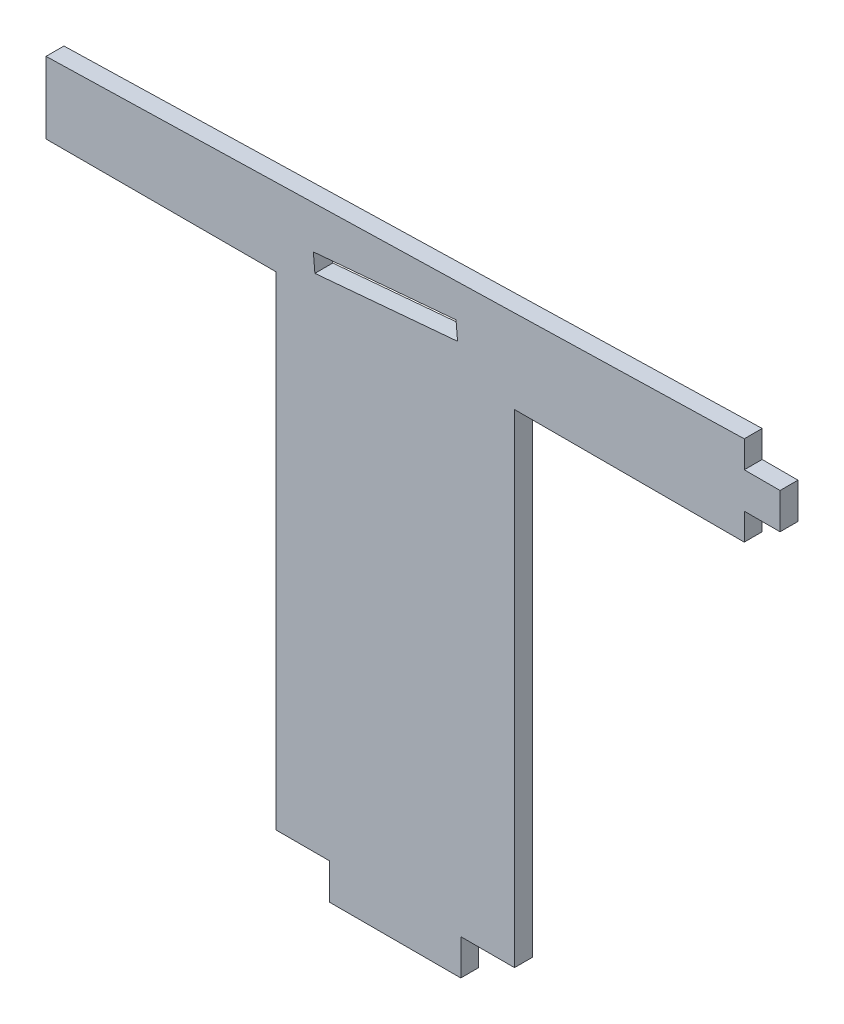
ISO-10303-21;
HEADER;
FILE_DESCRIPTION(('STEP AP214'),'2;1');
FILE_NAME('part.step','',(''),(''),'','','');
FILE_SCHEMA(('AUTOMOTIVE_DESIGN { 1 0 10303 214 1 1 1 1 }'));
ENDSEC;
DATA;
#1=APPLICATION_CONTEXT('core data for automotive mechanical design processes');
#2=APPLICATION_PROTOCOL_DEFINITION('international standard','automotive_design',2000,#1);
#3=PRODUCT_CONTEXT('',#1,'mechanical');
#4=PRODUCT('Part','Part','',(#3));
#5=PRODUCT_RELATED_PRODUCT_CATEGORY('part','',(#4));
#6=PRODUCT_DEFINITION_FORMATION('','',#4);
#7=PRODUCT_DEFINITION_CONTEXT('part definition',#1,'design');
#8=PRODUCT_DEFINITION('design','',#6,#7);
#9=PRODUCT_DEFINITION_SHAPE('','',#8);
#10=(LENGTH_UNIT() NAMED_UNIT(*) SI_UNIT(.MILLI.,.METRE.));
#11=(NAMED_UNIT(*) PLANE_ANGLE_UNIT() SI_UNIT($,.RADIAN.));
#12=(NAMED_UNIT(*) SI_UNIT($,.STERADIAN.) SOLID_ANGLE_UNIT());
#13=UNCERTAINTY_MEASURE_WITH_UNIT(LENGTH_MEASURE(1.E-05),#10,'distance_accuracy_value','');
#14=(GEOMETRIC_REPRESENTATION_CONTEXT(3) GLOBAL_UNCERTAINTY_ASSIGNED_CONTEXT((#13)) GLOBAL_UNIT_ASSIGNED_CONTEXT((#10,
#11,#12)) REPRESENTATION_CONTEXT('',''));
#15=CARTESIAN_POINT('',(0.,0.,0.));
#16=DIRECTION('',(0.,0.,1.));
#17=DIRECTION('',(1.,0.,0.));
#18=AXIS2_PLACEMENT_3D('',#15,#16,#17);
#19=CARTESIAN_POINT('',(-40.,0.,3.));
#20=DIRECTION('',(0.,1.,0.));
#21=DIRECTION('',(0.,0.,1.));
#22=AXIS2_PLACEMENT_3D('',#19,#20,#21);
#23=PLANE('',#22);
#24=DIRECTION('',(0.,0.,1.));
#25=VECTOR('',#24,1.);
#26=CARTESIAN_POINT('',(-9.,0.,0.));
#27=LINE('',#26,#25);
#28=CARTESIAN_POINT('',(-9.,0.,0.));
#29=VERTEX_POINT('',#28);
#30=CARTESIAN_POINT('',(-9.,0.,3.));
#31=VERTEX_POINT('',#30);
#32=EDGE_CURVE('E201',#29,#31,#27,.T.);
#33=ORIENTED_EDGE('',*,*,#32,.F.);
#34=DIRECTION('',(1.,0.,0.));
#35=VECTOR('',#34,1.);
#36=CARTESIAN_POINT('',(-40.,0.,0.));
#37=LINE('',#36,#35);
#38=CARTESIAN_POINT('',(0.,0.,0.));
#39=VERTEX_POINT('',#38);
#40=EDGE_CURVE('E291',#29,#39,#37,.T.);
#41=ORIENTED_EDGE('',*,*,#40,.T.);
#42=DIRECTION('',(0.,0.,-1.));
#43=VECTOR('',#42,1.);
#44=CARTESIAN_POINT('',(0.,0.,3.));
#45=LINE('',#44,#43);
#46=CARTESIAN_POINT('',(0.,0.,3.));
#47=VERTEX_POINT('',#46);
#48=EDGE_CURVE('E309',#47,#39,#45,.T.);
#49=ORIENTED_EDGE('',*,*,#48,.F.);
#50=DIRECTION('',(1.,0.,0.));
#51=VECTOR('',#50,1.);
#52=CARTESIAN_POINT('',(-40.,0.,3.));
#53=LINE('',#52,#51);
#54=EDGE_CURVE('E270',#31,#47,#53,.T.);
#55=ORIENTED_EDGE('',*,*,#54,.F.);
#56=EDGE_LOOP('',(#33,#41,#49,#55));
#57=FACE_BOUND('',#56,.T.);
#58=ADVANCED_FACE('F33',(#57),#23,.F.);
#59=CARTESIAN_POINT('',(38.5,96.,3.));
#60=DIRECTION('',(-1.,0.,0.));
#61=DIRECTION('',(0.,0.,1.));
#62=AXIS2_PLACEMENT_3D('',#59,#60,#61);
#63=PLANE('',#62);
#64=DIRECTION('',(0.,0.,1.));
#65=VECTOR('',#64,1.);
#66=CARTESIAN_POINT('',(38.5,91.5,0.));
#67=LINE('',#66,#65);
#68=CARTESIAN_POINT('',(38.5,91.5,0.));
#69=VERTEX_POINT('',#68);
#70=CARTESIAN_POINT('',(38.5,91.5,3.));
#71=VERTEX_POINT('',#70);
#72=EDGE_CURVE('E220',#69,#71,#67,.T.);
#73=ORIENTED_EDGE('',*,*,#72,.F.);
#74=DIRECTION('',(0.,1.,0.));
#75=VECTOR('',#74,1.);
#76=CARTESIAN_POINT('',(38.5,96.,0.));
#77=LINE('',#76,#75);
#78=CARTESIAN_POINT('',(38.5,96.,0.));
#79=VERTEX_POINT('',#78);
#80=EDGE_CURVE('E298',#69,#79,#77,.T.);
#81=ORIENTED_EDGE('',*,*,#80,.T.);
#82=DIRECTION('',(0.,0.,-1.));
#83=VECTOR('',#82,1.);
#84=CARTESIAN_POINT('',(38.5,96.,3.));
#85=LINE('',#84,#83);
#86=CARTESIAN_POINT('',(38.5,96.,3.));
#87=VERTEX_POINT('',#86);
#88=EDGE_CURVE('E282',#87,#79,#85,.T.);
#89=ORIENTED_EDGE('',*,*,#88,.F.);
#90=DIRECTION('',(0.,1.,0.));
#91=VECTOR('',#90,1.);
#92=CARTESIAN_POINT('',(38.5,96.,3.));
#93=LINE('',#92,#91);
#94=EDGE_CURVE('E278',#71,#87,#93,.T.);
#95=ORIENTED_EDGE('',*,*,#94,.F.);
#96=EDGE_LOOP('',(#73,#81,#89,#95));
#97=FACE_BOUND('',#96,.T.);
#98=ADVANCED_FACE('F345',(#97),#63,.F.);
#99=CARTESIAN_POINT('',(-78.5,93.,3.));
#100=DIRECTION('',(0.0256326007925508,-0.999671430909481,0.));
#101=DIRECTION('',(0.999671430909481,0.0256326007925508,0.));
#102=AXIS2_PLACEMENT_3D('',#99,#100,#101);
#103=PLANE('',#102);
#104=DIRECTION('',(-0.999671430909481,-0.0256326007925508,0.));
#105=VECTOR('',#104,1.);
#106=CARTESIAN_POINT('',(-78.5,93.,0.));
#107=LINE('',#106,#105);
#108=CARTESIAN_POINT('',(-78.5,93.,0.));
#109=VERTEX_POINT('',#108);
#110=EDGE_CURVE('E253',#79,#109,#107,.T.);
#111=ORIENTED_EDGE('',*,*,#110,.T.);
#112=DIRECTION('',(0.,0.,-1.));
#113=VECTOR('',#112,1.);
#114=CARTESIAN_POINT('',(-78.5,93.,3.));
#115=LINE('',#114,#113);
#116=CARTESIAN_POINT('',(-78.5,93.,3.));
#117=VERTEX_POINT('',#116);
#118=EDGE_CURVE('E11',#117,#109,#115,.T.);
#119=ORIENTED_EDGE('',*,*,#118,.F.);
#120=DIRECTION('',(-0.999671430909481,-0.0256326007925508,0.));
#121=VECTOR('',#120,1.);
#122=CARTESIAN_POINT('',(-78.5,93.,3.));
#123=LINE('',#122,#121);
#124=EDGE_CURVE('E260',#87,#117,#123,.T.);
#125=ORIENTED_EDGE('',*,*,#124,.F.);
#126=ORIENTED_EDGE('',*,*,#88,.T.);
#127=EDGE_LOOP('',(#111,#119,#125,#126));
#128=FACE_BOUND('',#127,.T.);
#129=ADVANCED_FACE('F35',(#128),#103,.F.);
#130=CARTESIAN_POINT('',(-78.5,93.,3.));
#131=DIRECTION('',(1.,0.,0.));
#132=DIRECTION('',(0.,0.,-1.));
#133=AXIS2_PLACEMENT_3D('',#130,#131,#132);
#134=PLANE('',#133);
#135=DIRECTION('',(0.,-1.,0.));
#136=VECTOR('',#135,1.);
#137=CARTESIAN_POINT('',(-78.5,93.,0.));
#138=LINE('',#137,#136);
#139=CARTESIAN_POINT('',(-78.5,81.,0.));
#140=VERTEX_POINT('',#139);
#141=EDGE_CURVE('E285',#109,#140,#138,.T.);
#142=ORIENTED_EDGE('',*,*,#141,.T.);
#143=DIRECTION('',(0.,0.,-1.));
#144=VECTOR('',#143,1.);
#145=CARTESIAN_POINT('',(-78.5,81.,3.));
#146=LINE('',#145,#144);
#147=CARTESIAN_POINT('',(-78.5,81.,3.));
#148=VERTEX_POINT('',#147);
#149=EDGE_CURVE('E41',#148,#140,#146,.T.);
#150=ORIENTED_EDGE('',*,*,#149,.F.);
#151=DIRECTION('',(0.,-1.,0.));
#152=VECTOR('',#151,1.);
#153=CARTESIAN_POINT('',(-78.5,93.,3.));
#154=LINE('',#153,#152);
#155=EDGE_CURVE('E263',#117,#148,#154,.T.);
#156=ORIENTED_EDGE('',*,*,#155,.F.);
#157=ORIENTED_EDGE('',*,*,#118,.T.);
#158=EDGE_LOOP('',(#142,#150,#156,#157));
#159=FACE_BOUND('',#158,.T.);
#160=ADVANCED_FACE('F337',(#159),#134,.F.);
#161=CARTESIAN_POINT('',(-78.5,81.,3.));
#162=DIRECTION('',(0.,1.,0.));
#163=DIRECTION('',(0.,0.,1.));
#164=AXIS2_PLACEMENT_3D('',#161,#162,#163);
#165=PLANE('',#164);
#166=DIRECTION('',(1.,0.,0.));
#167=VECTOR('',#166,1.);
#168=CARTESIAN_POINT('',(-78.5,81.,0.));
#169=LINE('',#168,#167);
#170=CARTESIAN_POINT('',(-40.,81.,0.));
#171=VERTEX_POINT('',#170);
#172=EDGE_CURVE('E287',#140,#171,#169,.T.);
#173=ORIENTED_EDGE('',*,*,#172,.T.);
#174=DIRECTION('',(0.,0.,-1.));
#175=VECTOR('',#174,1.);
#176=CARTESIAN_POINT('',(-40.,81.,3.));
#177=LINE('',#176,#175);
#178=CARTESIAN_POINT('',(-40.,81.,3.));
#179=VERTEX_POINT('',#178);
#180=EDGE_CURVE('E315',#179,#171,#177,.T.);
#181=ORIENTED_EDGE('',*,*,#180,.F.);
#182=DIRECTION('',(1.,0.,0.));
#183=VECTOR('',#182,1.);
#184=CARTESIAN_POINT('',(-78.5,81.,3.));
#185=LINE('',#184,#183);
#186=EDGE_CURVE('E266',#148,#179,#185,.T.);
#187=ORIENTED_EDGE('',*,*,#186,.F.);
#188=ORIENTED_EDGE('',*,*,#149,.T.);
#189=EDGE_LOOP('',(#173,#181,#187,#188));
#190=FACE_BOUND('',#189,.T.);
#191=ADVANCED_FACE('F322',(#190),#165,.F.);
#192=CARTESIAN_POINT('',(-40.,81.,3.));
#193=DIRECTION('',(1.,0.,0.));
#194=DIRECTION('',(0.,1.,0.));
#195=AXIS2_PLACEMENT_3D('',#192,#193,#194);
#196=PLANE('',#195);
#197=DIRECTION('',(0.,-1.,0.));
#198=VECTOR('',#197,1.);
#199=CARTESIAN_POINT('',(-40.,81.,0.));
#200=LINE('',#199,#198);
#201=CARTESIAN_POINT('',(-40.,0.,0.));
#202=VERTEX_POINT('',#201);
#203=EDGE_CURVE('E289',#171,#202,#200,.T.);
#204=ORIENTED_EDGE('',*,*,#203,.T.);
#205=DIRECTION('',(0.,0.,-1.));
#206=VECTOR('',#205,1.);
#207=CARTESIAN_POINT('',(-40.,0.,3.));
#208=LINE('',#207,#206);
#209=CARTESIAN_POINT('',(-40.,0.,3.));
#210=VERTEX_POINT('',#209);
#211=EDGE_CURVE('E312',#210,#202,#208,.T.);
#212=ORIENTED_EDGE('',*,*,#211,.F.);
#213=DIRECTION('',(0.,-1.,0.));
#214=VECTOR('',#213,1.);
#215=CARTESIAN_POINT('',(-40.,81.,3.));
#216=LINE('',#215,#214);
#217=EDGE_CURVE('E268',#179,#210,#216,.T.);
#218=ORIENTED_EDGE('',*,*,#217,.F.);
#219=ORIENTED_EDGE('',*,*,#180,.T.);
#220=EDGE_LOOP('',(#204,#212,#218,#219));
#221=FACE_BOUND('',#220,.T.);
#222=ADVANCED_FACE('F328',(#221),#196,.F.);
#223=CARTESIAN_POINT('',(-31.,0.,0.));
#224=VERTEX_POINT('',#223);
#225=EDGE_CURVE('E292',#202,#224,#37,.T.);
#226=ORIENTED_EDGE('',*,*,#225,.T.);
#227=DIRECTION('',(0.,0.,1.));
#228=VECTOR('',#227,1.);
#229=CARTESIAN_POINT('',(-31.,0.,0.));
#230=LINE('',#229,#228);
#231=CARTESIAN_POINT('',(-31.,0.,3.));
#232=VERTEX_POINT('',#231);
#233=EDGE_CURVE('E191',#224,#232,#230,.T.);
#234=ORIENTED_EDGE('',*,*,#233,.T.);
#235=EDGE_CURVE('E271',#210,#232,#53,.T.);
#236=ORIENTED_EDGE('',*,*,#235,.F.);
#237=ORIENTED_EDGE('',*,*,#211,.T.);
#238=EDGE_LOOP('',(#226,#234,#236,#237));
#239=FACE_BOUND('',#238,.T.);
#240=ADVANCED_FACE('F332',(#239),#23,.F.);
#241=CARTESIAN_POINT('',(0.,0.,3.));
#242=DIRECTION('',(-1.,0.,0.));
#243=DIRECTION('',(0.,-1.,0.));
#244=AXIS2_PLACEMENT_3D('',#241,#242,#243);
#245=PLANE('',#244);
#246=DIRECTION('',(0.,1.,0.));
#247=VECTOR('',#246,1.);
#248=CARTESIAN_POINT('',(0.,0.,0.));
#249=LINE('',#248,#247);
#250=CARTESIAN_POINT('',(0.,81.,0.));
#251=VERTEX_POINT('',#250);
#252=EDGE_CURVE('E294',#39,#251,#249,.T.);
#253=ORIENTED_EDGE('',*,*,#252,.T.);
#254=DIRECTION('',(0.,0.,-1.));
#255=VECTOR('',#254,1.);
#256=CARTESIAN_POINT('',(0.,81.,3.));
#257=LINE('',#256,#255);
#258=CARTESIAN_POINT('',(0.,81.,3.));
#259=VERTEX_POINT('',#258);
#260=EDGE_CURVE('E306',#259,#251,#257,.T.);
#261=ORIENTED_EDGE('',*,*,#260,.F.);
#262=DIRECTION('',(0.,1.,0.));
#263=VECTOR('',#262,1.);
#264=CARTESIAN_POINT('',(0.,0.,3.));
#265=LINE('',#264,#263);
#266=EDGE_CURVE('E274',#47,#259,#265,.T.);
#267=ORIENTED_EDGE('',*,*,#266,.F.);
#268=ORIENTED_EDGE('',*,*,#48,.T.);
#269=EDGE_LOOP('',(#253,#261,#267,#268));
#270=FACE_BOUND('',#269,.T.);
#271=ADVANCED_FACE('F368',(#270),#245,.F.);
#272=CARTESIAN_POINT('',(0.,81.,3.));
#273=DIRECTION('',(0.,1.,0.));
#274=DIRECTION('',(0.,0.,1.));
#275=AXIS2_PLACEMENT_3D('',#272,#273,#274);
#276=PLANE('',#275);
#277=DIRECTION('',(1.,0.,0.));
#278=VECTOR('',#277,1.);
#279=CARTESIAN_POINT('',(0.,81.,0.));
#280=LINE('',#279,#278);
#281=CARTESIAN_POINT('',(38.5,81.,0.));
#282=VERTEX_POINT('',#281);
#283=EDGE_CURVE('E296',#251,#282,#280,.T.);
#284=ORIENTED_EDGE('',*,*,#283,.T.);
#285=DIRECTION('',(0.,0.,-1.));
#286=VECTOR('',#285,1.);
#287=CARTESIAN_POINT('',(38.5,81.,3.));
#288=LINE('',#287,#286);
#289=CARTESIAN_POINT('',(38.5,81.,3.));
#290=VERTEX_POINT('',#289);
#291=EDGE_CURVE('E303',#290,#282,#288,.T.);
#292=ORIENTED_EDGE('',*,*,#291,.F.);
#293=DIRECTION('',(1.,0.,0.));
#294=VECTOR('',#293,1.);
#295=CARTESIAN_POINT('',(0.,81.,3.));
#296=LINE('',#295,#294);
#297=EDGE_CURVE('E276',#259,#290,#296,.T.);
#298=ORIENTED_EDGE('',*,*,#297,.F.);
#299=ORIENTED_EDGE('',*,*,#260,.T.);
#300=EDGE_LOOP('',(#284,#292,#298,#299));
#301=FACE_BOUND('',#300,.T.);
#302=ADVANCED_FACE('F364',(#301),#276,.F.);
#303=CARTESIAN_POINT('',(38.5,85.5,0.));
#304=VERTEX_POINT('',#303);
#305=EDGE_CURVE('E264',#282,#304,#77,.T.);
#306=ORIENTED_EDGE('',*,*,#305,.T.);
#307=DIRECTION('',(0.,0.,1.));
#308=VECTOR('',#307,1.);
#309=CARTESIAN_POINT('',(38.5,85.5,0.));
#310=LINE('',#309,#308);
#311=CARTESIAN_POINT('',(38.5,85.5,3.));
#312=VERTEX_POINT('',#311);
#313=EDGE_CURVE('E213',#304,#312,#310,.T.);
#314=ORIENTED_EDGE('',*,*,#313,.T.);
#315=EDGE_CURVE('E279',#290,#312,#93,.T.);
#316=ORIENTED_EDGE('',*,*,#315,.F.);
#317=ORIENTED_EDGE('',*,*,#291,.T.);
#318=EDGE_LOOP('',(#306,#314,#316,#317));
#319=FACE_BOUND('',#318,.T.);
#320=ADVANCED_FACE('F358',(#319),#63,.F.);
#321=CARTESIAN_POINT('',(0.,0.,3.));
#322=DIRECTION('',(0.,0.,-1.));
#323=DIRECTION('',(-1.,0.,0.));
#324=AXIS2_PLACEMENT_3D('',#321,#322,#323);
#325=PLANE('',#324);
#326=DIRECTION('',(0.0871557427476511,-0.996194698091746,0.));
#327=VECTOR('',#326,1.);
#328=CARTESIAN_POINT('',(-33.71,87.02,3.));
#329=LINE('',#328,#327);
#330=CARTESIAN_POINT('',(-33.71,87.02,3.));
#331=VERTEX_POINT('',#330);
#332=CARTESIAN_POINT('',(-33.4485327717571,84.0314159057247,3.));
#333=VERTEX_POINT('',#332);
#334=EDGE_CURVE('E243',#331,#333,#329,.T.);
#335=ORIENTED_EDGE('',*,*,#334,.F.);
#336=DIRECTION('',(-0.996194698091746,-0.0871557427476518,0.));
#337=VECTOR('',#336,1.);
#338=CARTESIAN_POINT('',(-9.8013272457981,89.1117378259436,3.));
#339=LINE('',#338,#337);
#340=CARTESIAN_POINT('',(-9.8013272457981,89.1117378259436,3.));
#341=VERTEX_POINT('',#340);
#342=EDGE_CURVE('E222',#341,#331,#339,.T.);
#343=ORIENTED_EDGE('',*,*,#342,.F.);
#344=DIRECTION('',(-0.0871557427476517,0.996194698091746,0.));
#345=VECTOR('',#344,1.);
#346=CARTESIAN_POINT('',(-9.53986001755514,86.1231537316684,3.));
#347=LINE('',#346,#345);
#348=CARTESIAN_POINT('',(-9.53986001755514,86.1231537316684,3.));
#349=VERTEX_POINT('',#348);
#350=EDGE_CURVE('E232',#349,#341,#347,.T.);
#351=ORIENTED_EDGE('',*,*,#350,.F.);
#352=DIRECTION('',(0.996194698091746,0.0871557427476518,0.));
#353=VECTOR('',#352,1.);
#354=CARTESIAN_POINT('',(-33.4485327717571,84.0314159057247,3.));
#355=LINE('',#354,#353);
#356=EDGE_CURVE('E246',#333,#349,#355,.T.);
#357=ORIENTED_EDGE('',*,*,#356,.F.);
#358=EDGE_LOOP('',(#335,#343,#351,#357));
#359=FACE_BOUND('',#358,.T.);
#360=ORIENTED_EDGE('',*,*,#124,.T.);
#361=ORIENTED_EDGE('',*,*,#155,.T.);
#362=ORIENTED_EDGE('',*,*,#186,.T.);
#363=ORIENTED_EDGE('',*,*,#217,.T.);
#364=ORIENTED_EDGE('',*,*,#235,.T.);
#365=DIRECTION('',(0.,-1.,0.));
#366=VECTOR('',#365,1.);
#367=CARTESIAN_POINT('',(-31.,0.,3.));
#368=LINE('',#367,#366);
#369=CARTESIAN_POINT('',(-31.,-6.,3.));
#370=VERTEX_POINT('',#369);
#371=EDGE_CURVE('E48',#232,#370,#368,.T.);
#372=ORIENTED_EDGE('',*,*,#371,.T.);
#373=DIRECTION('',(1.,0.,0.));
#374=VECTOR('',#373,1.);
#375=CARTESIAN_POINT('',(-31.,-6.,3.));
#376=LINE('',#375,#374);
#377=CARTESIAN_POINT('',(-9.,-6.,3.));
#378=VERTEX_POINT('',#377);
#379=EDGE_CURVE('E175',#370,#378,#376,.T.);
#380=ORIENTED_EDGE('',*,*,#379,.T.);
#381=DIRECTION('',(0.,1.,0.));
#382=VECTOR('',#381,1.);
#383=CARTESIAN_POINT('',(-9.,0.,3.));
#384=LINE('',#383,#382);
#385=EDGE_CURVE('E192',#378,#31,#384,.T.);
#386=ORIENTED_EDGE('',*,*,#385,.T.);
#387=ORIENTED_EDGE('',*,*,#54,.T.);
#388=ORIENTED_EDGE('',*,*,#266,.T.);
#389=ORIENTED_EDGE('',*,*,#297,.T.);
#390=ORIENTED_EDGE('',*,*,#315,.T.);
#391=DIRECTION('',(1.,0.,0.));
#392=VECTOR('',#391,1.);
#393=CARTESIAN_POINT('',(38.5,85.5,3.));
#394=LINE('',#393,#392);
#395=CARTESIAN_POINT('',(44.5,85.5,3.));
#396=VERTEX_POINT('',#395);
#397=EDGE_CURVE('E56',#312,#396,#394,.T.);
#398=ORIENTED_EDGE('',*,*,#397,.T.);
#399=DIRECTION('',(0.,1.,0.));
#400=VECTOR('',#399,1.);
#401=CARTESIAN_POINT('',(44.5,91.5,3.));
#402=LINE('',#401,#400);
#403=CARTESIAN_POINT('',(44.5,91.5,3.));
#404=VERTEX_POINT('',#403);
#405=EDGE_CURVE('E215',#396,#404,#402,.T.);
#406=ORIENTED_EDGE('',*,*,#405,.T.);
#407=DIRECTION('',(-1.,0.,0.));
#408=VECTOR('',#407,1.);
#409=CARTESIAN_POINT('',(38.5,91.5,3.));
#410=LINE('',#409,#408);
#411=EDGE_CURVE('E208',#404,#71,#410,.T.);
#412=ORIENTED_EDGE('',*,*,#411,.T.);
#413=ORIENTED_EDGE('',*,*,#94,.T.);
#414=EDGE_LOOP('',(#360,#361,#362,#363,#364,#372,#380,#386,#387,#388,#389,#390,#398,#406,#412,#413));
#415=FACE_BOUND('',#414,.T.);
#416=ADVANCED_FACE('F334',(#359,#415),#325,.F.);
#417=CARTESIAN_POINT('',(0.,0.,0.));
#418=DIRECTION('',(0.,0.,-1.));
#419=DIRECTION('',(-1.,0.,0.));
#420=AXIS2_PLACEMENT_3D('',#417,#418,#419);
#421=PLANE('',#420);
#422=DIRECTION('',(-0.996194698091746,-0.0871557427476518,0.));
#423=VECTOR('',#422,1.);
#424=CARTESIAN_POINT('',(-9.8013272457981,89.1117378259436,0.));
#425=LINE('',#424,#423);
#426=CARTESIAN_POINT('',(-9.8013272457981,89.1117378259436,0.));
#427=VERTEX_POINT('',#426);
#428=CARTESIAN_POINT('',(-33.71,87.02,0.));
#429=VERTEX_POINT('',#428);
#430=EDGE_CURVE('E228',#427,#429,#425,.T.);
#431=ORIENTED_EDGE('',*,*,#430,.T.);
#432=DIRECTION('',(0.0871557427476511,-0.996194698091746,0.));
#433=VECTOR('',#432,1.);
#434=CARTESIAN_POINT('',(-33.71,87.02,0.));
#435=LINE('',#434,#433);
#436=CARTESIAN_POINT('',(-33.4485327717571,84.0314159057247,0.));
#437=VERTEX_POINT('',#436);
#438=EDGE_CURVE('E231',#429,#437,#435,.T.);
#439=ORIENTED_EDGE('',*,*,#438,.T.);
#440=DIRECTION('',(0.996194698091746,0.0871557427476518,0.));
#441=VECTOR('',#440,1.);
#442=CARTESIAN_POINT('',(-33.4485327717571,84.0314159057247,0.));
#443=LINE('',#442,#441);
#444=CARTESIAN_POINT('',(-9.53986001755514,86.1231537316684,0.));
#445=VERTEX_POINT('',#444);
#446=EDGE_CURVE('E235',#437,#445,#443,.T.);
#447=ORIENTED_EDGE('',*,*,#446,.T.);
#448=DIRECTION('',(-0.0871557427476517,0.996194698091746,0.));
#449=VECTOR('',#448,1.);
#450=CARTESIAN_POINT('',(-9.53986001755514,86.1231537316684,0.));
#451=LINE('',#450,#449);
#452=EDGE_CURVE('E238',#445,#427,#451,.T.);
#453=ORIENTED_EDGE('',*,*,#452,.T.);
#454=EDGE_LOOP('',(#431,#439,#447,#453));
#455=FACE_BOUND('',#454,.T.);
#456=ORIENTED_EDGE('',*,*,#110,.F.);
#457=ORIENTED_EDGE('',*,*,#80,.F.);
#458=DIRECTION('',(-1.,0.,0.));
#459=VECTOR('',#458,1.);
#460=CARTESIAN_POINT('',(38.5,91.5,0.));
#461=LINE('',#460,#459);
#462=CARTESIAN_POINT('',(44.5,91.5,0.));
#463=VERTEX_POINT('',#462);
#464=EDGE_CURVE('E211',#463,#69,#461,.T.);
#465=ORIENTED_EDGE('',*,*,#464,.F.);
#466=DIRECTION('',(0.,1.,0.));
#467=VECTOR('',#466,1.);
#468=CARTESIAN_POINT('',(44.5,91.5,0.));
#469=LINE('',#468,#467);
#470=CARTESIAN_POINT('',(44.5,85.5,0.));
#471=VERTEX_POINT('',#470);
#472=EDGE_CURVE('E207',#471,#463,#469,.T.);
#473=ORIENTED_EDGE('',*,*,#472,.F.);
#474=DIRECTION('',(1.,0.,0.));
#475=VECTOR('',#474,1.);
#476=CARTESIAN_POINT('',(38.5,85.5,0.));
#477=LINE('',#476,#475);
#478=EDGE_CURVE('E204',#304,#471,#477,.T.);
#479=ORIENTED_EDGE('',*,*,#478,.F.);
#480=ORIENTED_EDGE('',*,*,#305,.F.);
#481=ORIENTED_EDGE('',*,*,#283,.F.);
#482=ORIENTED_EDGE('',*,*,#252,.F.);
#483=ORIENTED_EDGE('',*,*,#40,.F.);
#484=DIRECTION('',(0.,1.,0.));
#485=VECTOR('',#484,1.);
#486=CARTESIAN_POINT('',(-9.,0.,0.));
#487=LINE('',#486,#485);
#488=CARTESIAN_POINT('',(-9.,-6.,0.));
#489=VERTEX_POINT('',#488);
#490=EDGE_CURVE('E178',#489,#29,#487,.T.);
#491=ORIENTED_EDGE('',*,*,#490,.F.);
#492=DIRECTION('',(1.,0.,0.));
#493=VECTOR('',#492,1.);
#494=CARTESIAN_POINT('',(-31.,-6.,0.));
#495=LINE('',#494,#493);
#496=CARTESIAN_POINT('',(-31.,-6.,0.));
#497=VERTEX_POINT('',#496);
#498=EDGE_CURVE('E173',#497,#489,#495,.T.);
#499=ORIENTED_EDGE('',*,*,#498,.F.);
#500=DIRECTION('',(0.,-1.,0.));
#501=VECTOR('',#500,1.);
#502=CARTESIAN_POINT('',(-31.,0.,0.));
#503=LINE('',#502,#501);
#504=EDGE_CURVE('E186',#224,#497,#503,.T.);
#505=ORIENTED_EDGE('',*,*,#504,.F.);
#506=ORIENTED_EDGE('',*,*,#225,.F.);
#507=ORIENTED_EDGE('',*,*,#203,.F.);
#508=ORIENTED_EDGE('',*,*,#172,.F.);
#509=ORIENTED_EDGE('',*,*,#141,.F.);
#510=EDGE_LOOP('',(#456,#457,#465,#473,#479,#480,#481,#482,#483,#491,#499,#505,#506,#507,#508,#509));
#511=FACE_BOUND('',#510,.T.);
#512=ADVANCED_FACE('F184',(#455,#511),#421,.T.);
#513=CARTESIAN_POINT('',(-9.8013272457981,89.1117378259436,0.));
#514=DIRECTION('',(-0.0871557427476518,0.996194698091746,0.));
#515=DIRECTION('',(-0.996194698091746,-0.0871557427476518,0.));
#516=AXIS2_PLACEMENT_3D('',#513,#514,#515);
#517=PLANE('',#516);
#518=ORIENTED_EDGE('',*,*,#342,.T.);
#519=DIRECTION('',(0.,0.,1.));
#520=VECTOR('',#519,1.);
#521=CARTESIAN_POINT('',(-33.71,87.02,0.));
#522=LINE('',#521,#520);
#523=EDGE_CURVE('E241',#429,#331,#522,.T.);
#524=ORIENTED_EDGE('',*,*,#523,.F.);
#525=ORIENTED_EDGE('',*,*,#430,.F.);
#526=DIRECTION('',(0.,0.,1.));
#527=VECTOR('',#526,1.);
#528=CARTESIAN_POINT('',(-9.8013272457981,89.1117378259436,0.));
#529=LINE('',#528,#527);
#530=EDGE_CURVE('E251',#427,#341,#529,.T.);
#531=ORIENTED_EDGE('',*,*,#530,.T.);
#532=EDGE_LOOP('',(#518,#524,#525,#531));
#533=FACE_BOUND('',#532,.T.);
#534=ADVANCED_FACE('F445',(#533),#517,.F.);
#535=CARTESIAN_POINT('',(-9.53986001755514,86.1231537316684,0.));
#536=DIRECTION('',(0.996194698091746,0.0871557427476516,0.));
#537=DIRECTION('',(-0.0871557427476517,0.996194698091746,0.));
#538=AXIS2_PLACEMENT_3D('',#535,#536,#537);
#539=PLANE('',#538);
#540=ORIENTED_EDGE('',*,*,#350,.T.);
#541=ORIENTED_EDGE('',*,*,#530,.F.);
#542=ORIENTED_EDGE('',*,*,#452,.F.);
#543=DIRECTION('',(0.,0.,1.));
#544=VECTOR('',#543,1.);
#545=CARTESIAN_POINT('',(-9.53986001755514,86.1231537316684,0.));
#546=LINE('',#545,#544);
#547=EDGE_CURVE('E254',#445,#349,#546,.T.);
#548=ORIENTED_EDGE('',*,*,#547,.T.);
#549=EDGE_LOOP('',(#540,#541,#542,#548));
#550=FACE_BOUND('',#549,.T.);
#551=ADVANCED_FACE('F450',(#550),#539,.F.);
#552=CARTESIAN_POINT('',(-33.4485327717571,84.0314159057247,0.));
#553=DIRECTION('',(0.0871557427476518,-0.996194698091746,0.));
#554=DIRECTION('',(0.996194698091746,0.0871557427476518,0.));
#555=AXIS2_PLACEMENT_3D('',#552,#553,#554);
#556=PLANE('',#555);
#557=ORIENTED_EDGE('',*,*,#356,.T.);
#558=ORIENTED_EDGE('',*,*,#547,.F.);
#559=ORIENTED_EDGE('',*,*,#446,.F.);
#560=DIRECTION('',(0.,0.,1.));
#561=VECTOR('',#560,1.);
#562=CARTESIAN_POINT('',(-33.4485327717571,84.0314159057247,0.));
#563=LINE('',#562,#561);
#564=EDGE_CURVE('E256',#437,#333,#563,.T.);
#565=ORIENTED_EDGE('',*,*,#564,.T.);
#566=EDGE_LOOP('',(#557,#558,#559,#565));
#567=FACE_BOUND('',#566,.T.);
#568=ADVANCED_FACE('F461',(#567),#556,.F.);
#569=CARTESIAN_POINT('',(-33.71,87.02,0.));
#570=DIRECTION('',(-0.996194698091746,-0.0871557427476511,0.));
#571=DIRECTION('',(0.0871557427476511,-0.996194698091746,0.));
#572=AXIS2_PLACEMENT_3D('',#569,#570,#571);
#573=PLANE('',#572);
#574=ORIENTED_EDGE('',*,*,#334,.T.);
#575=ORIENTED_EDGE('',*,*,#564,.F.);
#576=ORIENTED_EDGE('',*,*,#438,.F.);
#577=ORIENTED_EDGE('',*,*,#523,.T.);
#578=EDGE_LOOP('',(#574,#575,#576,#577));
#579=FACE_BOUND('',#578,.T.);
#580=ADVANCED_FACE('F470',(#579),#573,.F.);
#581=CARTESIAN_POINT('',(38.5,91.5,0.));
#582=DIRECTION('',(0.,1.,0.));
#583=DIRECTION('',(0.,0.,1.));
#584=AXIS2_PLACEMENT_3D('',#581,#582,#583);
#585=PLANE('',#584);
#586=ORIENTED_EDGE('',*,*,#411,.F.);
#587=DIRECTION('',(0.,0.,1.));
#588=VECTOR('',#587,1.);
#589=CARTESIAN_POINT('',(44.5,91.5,0.));
#590=LINE('',#589,#588);
#591=EDGE_CURVE('E223',#463,#404,#590,.T.);
#592=ORIENTED_EDGE('',*,*,#591,.F.);
#593=ORIENTED_EDGE('',*,*,#464,.T.);
#594=ORIENTED_EDGE('',*,*,#72,.T.);
#595=EDGE_LOOP('',(#586,#592,#593,#594));
#596=FACE_BOUND('',#595,.T.);
#597=ADVANCED_FACE('F349',(#596),#585,.T.);
#598=CARTESIAN_POINT('',(44.5,91.5,0.));
#599=DIRECTION('',(1.,0.,0.));
#600=DIRECTION('',(0.,0.,-1.));
#601=AXIS2_PLACEMENT_3D('',#598,#599,#600);
#602=PLANE('',#601);
#603=ORIENTED_EDGE('',*,*,#405,.F.);
#604=DIRECTION('',(0.,0.,1.));
#605=VECTOR('',#604,1.);
#606=CARTESIAN_POINT('',(44.5,85.5,0.));
#607=LINE('',#606,#605);
#608=EDGE_CURVE('E225',#471,#396,#607,.T.);
#609=ORIENTED_EDGE('',*,*,#608,.F.);
#610=ORIENTED_EDGE('',*,*,#472,.T.);
#611=ORIENTED_EDGE('',*,*,#591,.T.);
#612=EDGE_LOOP('',(#603,#609,#610,#611));
#613=FACE_BOUND('',#612,.T.);
#614=ADVANCED_FACE('F352',(#613),#602,.T.);
#615=CARTESIAN_POINT('',(38.5,85.5,0.));
#616=DIRECTION('',(0.,-1.,0.));
#617=DIRECTION('',(0.,0.,-1.));
#618=AXIS2_PLACEMENT_3D('',#615,#616,#617);
#619=PLANE('',#618);
#620=ORIENTED_EDGE('',*,*,#397,.F.);
#621=ORIENTED_EDGE('',*,*,#313,.F.);
#622=ORIENTED_EDGE('',*,*,#478,.T.);
#623=ORIENTED_EDGE('',*,*,#608,.T.);
#624=EDGE_LOOP('',(#620,#621,#622,#623));
#625=FACE_BOUND('',#624,.T.);
#626=ADVANCED_FACE('F355',(#625),#619,.T.);
#627=CARTESIAN_POINT('',(-31.,0.,0.));
#628=DIRECTION('',(-1.,0.,0.));
#629=DIRECTION('',(0.,0.,1.));
#630=AXIS2_PLACEMENT_3D('',#627,#628,#629);
#631=PLANE('',#630);
#632=ORIENTED_EDGE('',*,*,#371,.F.);
#633=ORIENTED_EDGE('',*,*,#233,.F.);
#634=ORIENTED_EDGE('',*,*,#504,.T.);
#635=DIRECTION('',(0.,0.,1.));
#636=VECTOR('',#635,1.);
#637=CARTESIAN_POINT('',(-31.,-6.,0.));
#638=LINE('',#637,#636);
#639=EDGE_CURVE('E170',#497,#370,#638,.T.);
#640=ORIENTED_EDGE('',*,*,#639,.T.);
#641=EDGE_LOOP('',(#632,#633,#634,#640));
#642=FACE_BOUND('',#641,.T.);
#643=ADVANCED_FACE('F190',(#642),#631,.T.);
#644=CARTESIAN_POINT('',(-9.,0.,0.));
#645=DIRECTION('',(1.,0.,0.));
#646=DIRECTION('',(0.,0.,-1.));
#647=AXIS2_PLACEMENT_3D('',#644,#645,#646);
#648=PLANE('',#647);
#649=ORIENTED_EDGE('',*,*,#385,.F.);
#650=DIRECTION('',(0.,0.,1.));
#651=VECTOR('',#650,1.);
#652=CARTESIAN_POINT('',(-9.,-6.,0.));
#653=LINE('',#652,#651);
#654=EDGE_CURVE('E177',#489,#378,#653,.T.);
#655=ORIENTED_EDGE('',*,*,#654,.F.);
#656=ORIENTED_EDGE('',*,*,#490,.T.);
#657=ORIENTED_EDGE('',*,*,#32,.T.);
#658=EDGE_LOOP('',(#649,#655,#656,#657));
#659=FACE_BOUND('',#658,.T.);
#660=ADVANCED_FACE('F375',(#659),#648,.T.);
#661=CARTESIAN_POINT('',(-31.,-6.,0.));
#662=DIRECTION('',(0.,-1.,0.));
#663=DIRECTION('',(0.,0.,-1.));
#664=AXIS2_PLACEMENT_3D('',#661,#662,#663);
#665=PLANE('',#664);
#666=ORIENTED_EDGE('',*,*,#379,.F.);
#667=ORIENTED_EDGE('',*,*,#639,.F.);
#668=ORIENTED_EDGE('',*,*,#498,.T.);
#669=ORIENTED_EDGE('',*,*,#654,.T.);
#670=EDGE_LOOP('',(#666,#667,#668,#669));
#671=FACE_BOUND('',#670,.T.);
#672=ADVANCED_FACE('F172',(#671),#665,.T.);
#673=CLOSED_SHELL('',(#58,#98,#129,#160,#191,#222,#240,#271,#302,#320,#416,#512,#534,#551,#568,
#580,#597,#614,#626,#643,#660,#672));
#674=MANIFOLD_SOLID_BREP('B2',#673);
#675=ADVANCED_BREP_SHAPE_REPRESENTATION('',(#18,#674),#14);
#676=SHAPE_DEFINITION_REPRESENTATION(#9,#675);
ENDSEC;
END-ISO-10303-21;
